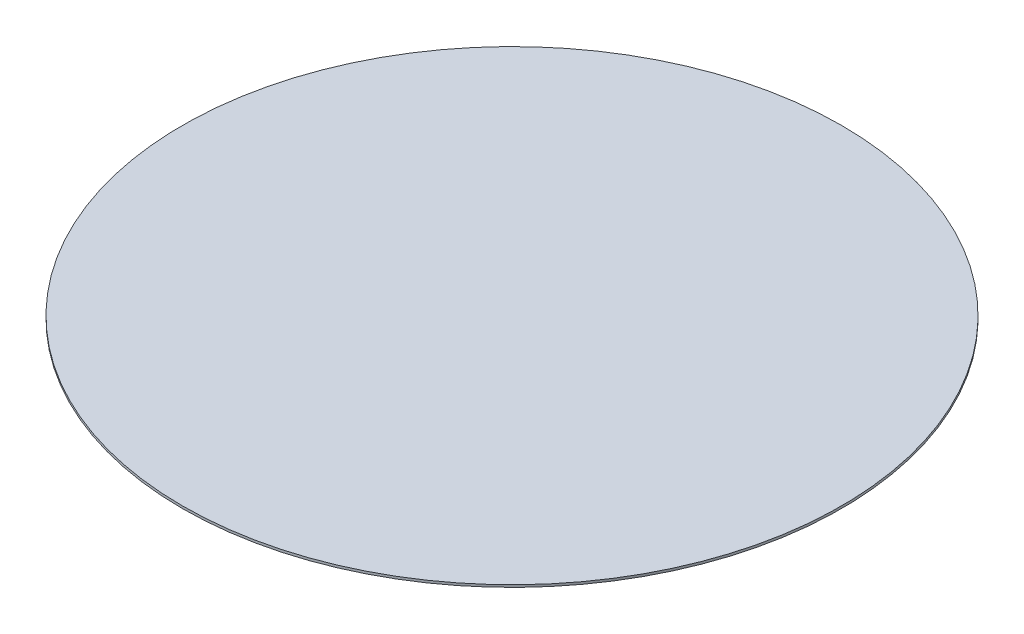
ISO-10303-21;
HEADER;
FILE_DESCRIPTION(('STEP AP214'),'2;1');
FILE_NAME('part.step','',(''),(''),'','','');
FILE_SCHEMA(('AUTOMOTIVE_DESIGN { 1 0 10303 214 1 1 1 1 }'));
ENDSEC;
DATA;
#1=APPLICATION_CONTEXT('core data for automotive mechanical design processes');
#2=APPLICATION_PROTOCOL_DEFINITION('international standard','automotive_design',2000,#1);
#3=PRODUCT_CONTEXT('',#1,'mechanical');
#4=PRODUCT('Part','Part','',(#3));
#5=PRODUCT_RELATED_PRODUCT_CATEGORY('part','',(#4));
#6=PRODUCT_DEFINITION_FORMATION('','',#4);
#7=PRODUCT_DEFINITION_CONTEXT('part definition',#1,'design');
#8=PRODUCT_DEFINITION('design','',#6,#7);
#9=PRODUCT_DEFINITION_SHAPE('','',#8);
#10=(LENGTH_UNIT() NAMED_UNIT(*) SI_UNIT(.MILLI.,.METRE.));
#11=(NAMED_UNIT(*) PLANE_ANGLE_UNIT() SI_UNIT($,.RADIAN.));
#12=(NAMED_UNIT(*) SI_UNIT($,.STERADIAN.) SOLID_ANGLE_UNIT());
#13=UNCERTAINTY_MEASURE_WITH_UNIT(LENGTH_MEASURE(1.E-05),#10,'distance_accuracy_value','');
#14=(GEOMETRIC_REPRESENTATION_CONTEXT(3) GLOBAL_UNCERTAINTY_ASSIGNED_CONTEXT((#13)) GLOBAL_UNIT_ASSIGNED_CONTEXT((#10,
#11,#12)) REPRESENTATION_CONTEXT('',''));
#15=CARTESIAN_POINT('',(0.,0.,0.));
#16=DIRECTION('',(0.,0.,1.));
#17=DIRECTION('',(1.,0.,0.));
#18=AXIS2_PLACEMENT_3D('',#15,#16,#17);
#19=CARTESIAN_POINT('',(0.,1.,0.));
#20=DIRECTION('',(0.,-1.,0.));
#21=DIRECTION('',(0.,0.,-1.));
#22=AXIS2_PLACEMENT_3D('',#19,#20,#21);
#23=CYLINDRICAL_SURFACE('',#22,140.);
#24=CARTESIAN_POINT('',(0.,1.,0.));
#25=DIRECTION('',(0.,1.,0.));
#26=DIRECTION('',(0.,0.,1.));
#27=AXIS2_PLACEMENT_3D('',#24,#25,#26);
#28=CIRCLE('',#27,140.);
#29=CARTESIAN_POINT('',(0.,1.,140.));
#30=VERTEX_POINT('',#29);
#31=EDGE_CURVE('E10',#30,#30,#28,.T.);
#32=ORIENTED_EDGE('',*,*,#31,.F.);
#33=EDGE_LOOP('',(#32));
#34=FACE_BOUND('',#33,.T.);
#35=CARTESIAN_POINT('',(0.,0.,0.));
#36=DIRECTION('',(0.,1.,0.));
#37=DIRECTION('',(0.,0.,1.));
#38=AXIS2_PLACEMENT_3D('',#35,#36,#37);
#39=CIRCLE('',#38,140.);
#40=CARTESIAN_POINT('',(0.,0.,140.));
#41=VERTEX_POINT('',#40);
#42=EDGE_CURVE('E33',#41,#41,#39,.T.);
#43=ORIENTED_EDGE('',*,*,#42,.T.);
#44=EDGE_LOOP('',(#43));
#45=FACE_BOUND('',#44,.T.);
#46=ADVANCED_FACE('F30',(#34,#45),#23,.T.);
#47=CARTESIAN_POINT('',(0.,1.,0.));
#48=DIRECTION('',(0.,1.,0.));
#49=DIRECTION('',(0.,0.,1.));
#50=AXIS2_PLACEMENT_3D('',#47,#48,#49);
#51=PLANE('',#50);
#52=ORIENTED_EDGE('',*,*,#31,.T.);
#53=EDGE_LOOP('',(#52));
#54=FACE_BOUND('',#53,.T.);
#55=ADVANCED_FACE('F45',(#54),#51,.T.);
#56=CARTESIAN_POINT('',(0.,0.,0.));
#57=DIRECTION('',(0.,1.,0.));
#58=DIRECTION('',(0.,0.,1.));
#59=AXIS2_PLACEMENT_3D('',#56,#57,#58);
#60=PLANE('',#59);
#61=ORIENTED_EDGE('',*,*,#42,.F.);
#62=EDGE_LOOP('',(#61));
#63=FACE_BOUND('',#62,.T.);
#64=ADVANCED_FACE('F43',(#63),#60,.F.);
#65=CLOSED_SHELL('',(#46,#55,#64));
#66=MANIFOLD_SOLID_BREP('B2',#65);
#67=ADVANCED_BREP_SHAPE_REPRESENTATION('',(#18,#66),#14);
#68=SHAPE_DEFINITION_REPRESENTATION(#9,#67);
ENDSEC;
END-ISO-10303-21;
